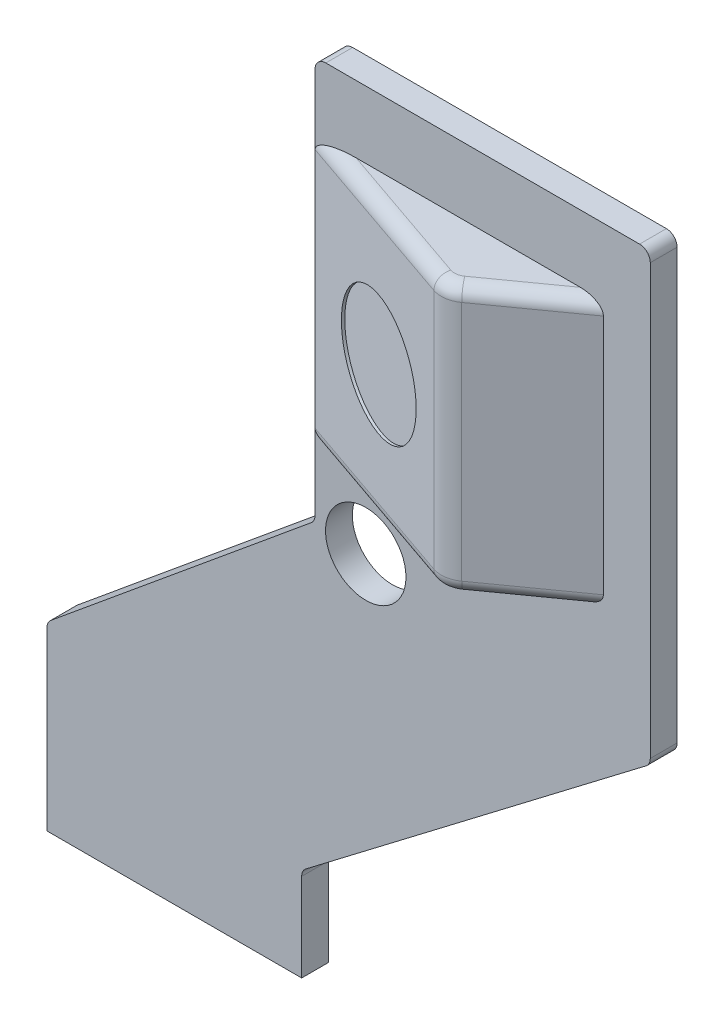
ISO-10303-21;
HEADER;
FILE_DESCRIPTION(('STEP AP214'),'2;1');
FILE_NAME('part.step','',(''),(''),'','','');
FILE_SCHEMA(('AUTOMOTIVE_DESIGN { 1 0 10303 214 1 1 1 1 }'));
ENDSEC;
DATA;
#1=APPLICATION_CONTEXT('core data for automotive mechanical design processes');
#2=APPLICATION_PROTOCOL_DEFINITION('international standard','automotive_design',2000,#1);
#3=PRODUCT_CONTEXT('',#1,'mechanical');
#4=PRODUCT('Part','Part','',(#3));
#5=PRODUCT_RELATED_PRODUCT_CATEGORY('part','',(#4));
#6=PRODUCT_DEFINITION_FORMATION('','',#4);
#7=PRODUCT_DEFINITION_CONTEXT('part definition',#1,'design');
#8=PRODUCT_DEFINITION('design','',#6,#7);
#9=PRODUCT_DEFINITION_SHAPE('','',#8);
#10=(LENGTH_UNIT() NAMED_UNIT(*) SI_UNIT(.MILLI.,.METRE.));
#11=(NAMED_UNIT(*) PLANE_ANGLE_UNIT() SI_UNIT($,.RADIAN.));
#12=(NAMED_UNIT(*) SI_UNIT($,.STERADIAN.) SOLID_ANGLE_UNIT());
#13=UNCERTAINTY_MEASURE_WITH_UNIT(LENGTH_MEASURE(1.E-05),#10,'distance_accuracy_value','');
#14=(GEOMETRIC_REPRESENTATION_CONTEXT(3) GLOBAL_UNCERTAINTY_ASSIGNED_CONTEXT((#13)) GLOBAL_UNIT_ASSIGNED_CONTEXT((#10,
#11,#12)) REPRESENTATION_CONTEXT('',''));
#15=CARTESIAN_POINT('',(0.,0.,0.));
#16=DIRECTION('',(0.,0.,1.));
#17=DIRECTION('',(1.,0.,0.));
#18=AXIS2_PLACEMENT_3D('',#15,#16,#17);
#19=CARTESIAN_POINT('',(-22.5,30.,0.));
#20=DIRECTION('',(0.,0.,-1.));
#21=DIRECTION('',(-1.,0.,0.));
#22=AXIS2_PLACEMENT_3D('',#19,#20,#21);
#23=PLANE('',#22);
#24=CARTESIAN_POINT('',(1.2792112476062,-0.215927904638984,0.));
#25=DIRECTION('',(0.,0.,1.));
#26=DIRECTION('',(1.,0.,0.));
#27=AXIS2_PLACEMENT_3D('',#24,#25,#26);
#28=CIRCLE('',#27,3.);
#29=CARTESIAN_POINT('',(4.2792112476062,-0.215927904638984,0.));
#30=VERTEX_POINT('',#29);
#31=EDGE_CURVE('E392',#30,#30,#28,.T.);
#32=ORIENTED_EDGE('',*,*,#31,.F.);
#33=EDGE_LOOP('',(#32));
#34=FACE_BOUND('',#33,.T.);
#35=DIRECTION('',(-0.771373278540077,-0.636382954795564,0.));
#36=VECTOR('',#35,1.);
#37=CARTESIAN_POINT('',(-22.5,-16.5,0.));
#38=LINE('',#37,#36);
#39=CARTESIAN_POINT('',(-2.79089363616354,-0.239987249834917,0.));
#40=VERTEX_POINT('',#39);
#41=CARTESIAN_POINT('',(-22.2091063638364,-16.2600127501651,0.));
#42=VERTEX_POINT('',#41);
#43=EDGE_CURVE('E194',#40,#42,#38,.T.);
#44=ORIENTED_EDGE('',*,*,#43,.T.);
#45=CARTESIAN_POINT('',(-21.7,-16.8771113729971,0.));
#46=DIRECTION('',(0.,0.,-1.));
#47=DIRECTION('',(-1.,0.,0.));
#48=AXIS2_PLACEMENT_3D('',#45,#46,#47);
#49=CIRCLE('',#48,0.8);
#50=CARTESIAN_POINT('',(-22.5,-16.8771113729971,0.));
#51=VERTEX_POINT('',#50);
#52=EDGE_CURVE('E269',#42,#51,#49,.F.);
#53=ORIENTED_EDGE('',*,*,#52,.T.);
#54=DIRECTION('',(0.,-1.,0.));
#55=VECTOR('',#54,1.);
#56=CARTESIAN_POINT('',(-22.5,-30.,0.));
#57=LINE('',#56,#55);
#58=CARTESIAN_POINT('',(-22.5,-30.,0.));
#59=VERTEX_POINT('',#58);
#60=EDGE_CURVE('E223',#51,#59,#57,.T.);
#61=ORIENTED_EDGE('',*,*,#60,.T.);
#62=DIRECTION('',(1.,0.,0.));
#63=VECTOR('',#62,1.);
#64=CARTESIAN_POINT('',(-3.49999999999999,-30.,0.));
#65=LINE('',#64,#63);
#66=CARTESIAN_POINT('',(-3.49999999999999,-30.,0.));
#67=VERTEX_POINT('',#66);
#68=EDGE_CURVE('E200',#59,#67,#65,.T.);
#69=ORIENTED_EDGE('',*,*,#68,.T.);
#70=DIRECTION('',(0.,1.,0.));
#71=VECTOR('',#70,1.);
#72=CARTESIAN_POINT('',(-3.49999999999999,-23.0388546298408,0.));
#73=LINE('',#72,#71);
#74=CARTESIAN_POINT('',(-3.49999999999999,-23.4349115523728,0.));
#75=VERTEX_POINT('',#74);
#76=EDGE_CURVE('E227',#67,#75,#73,.T.);
#77=ORIENTED_EDGE('',*,*,#76,.T.);
#78=CARTESIAN_POINT('',(-2.69999999999999,-23.4349115523728,0.));
#79=DIRECTION('',(0.,0.,-1.));
#80=DIRECTION('',(-1.,0.,0.));
#81=AXIS2_PLACEMENT_3D('',#78,#79,#80);
#82=CIRCLE('',#81,0.8);
#83=CARTESIAN_POINT('',(-3.18504204576897,-22.7987243049084,0.));
#84=VERTEX_POINT('',#83);
#85=EDGE_CURVE('E42',#75,#84,#82,.T.);
#86=ORIENTED_EDGE('',*,*,#85,.T.);
#87=DIRECTION('',(0.795234059330419,0.606302557211219,0.));
#88=VECTOR('',#87,1.);
#89=CARTESIAN_POINT('',(22.5,-3.21592790463898,0.));
#90=LINE('',#89,#88);
#91=CARTESIAN_POINT('',(22.185042045769,-3.45605822957133,0.));
#92=VERTEX_POINT('',#91);
#93=EDGE_CURVE('E230',#84,#92,#90,.T.);
#94=ORIENTED_EDGE('',*,*,#93,.T.);
#95=CARTESIAN_POINT('',(21.7,-2.819870982107,0.));
#96=DIRECTION('',(0.,0.,-1.));
#97=DIRECTION('',(-1.,0.,0.));
#98=AXIS2_PLACEMENT_3D('',#95,#96,#97);
#99=CIRCLE('',#98,0.8);
#100=CARTESIAN_POINT('',(22.5,-2.819870982107,0.));
#101=VERTEX_POINT('',#100);
#102=EDGE_CURVE('E267',#92,#101,#99,.F.);
#103=ORIENTED_EDGE('',*,*,#102,.T.);
#104=DIRECTION('',(0.,1.,0.));
#105=VECTOR('',#104,1.);
#106=CARTESIAN_POINT('',(22.5,30.,0.));
#107=LINE('',#106,#105);
#108=CARTESIAN_POINT('',(22.5,29.2,0.));
#109=VERTEX_POINT('',#108);
#110=EDGE_CURVE('E233',#101,#109,#107,.T.);
#111=ORIENTED_EDGE('',*,*,#110,.T.);
#112=CARTESIAN_POINT('',(21.7,29.2,0.));
#113=DIRECTION('',(0.,0.,-1.));
#114=DIRECTION('',(-1.,0.,0.));
#115=AXIS2_PLACEMENT_3D('',#112,#113,#114);
#116=CIRCLE('',#115,0.8);
#117=CARTESIAN_POINT('',(21.7,30.,0.));
#118=VERTEX_POINT('',#117);
#119=EDGE_CURVE('E263',#109,#118,#116,.F.);
#120=ORIENTED_EDGE('',*,*,#119,.T.);
#121=DIRECTION('',(-1.,0.,0.));
#122=VECTOR('',#121,1.);
#123=CARTESIAN_POINT('',(-2.50000000000001,30.,0.));
#124=LINE('',#123,#122);
#125=CARTESIAN_POINT('',(-1.70000000000001,30.,0.));
#126=VERTEX_POINT('',#125);
#127=EDGE_CURVE('E236',#118,#126,#124,.T.);
#128=ORIENTED_EDGE('',*,*,#127,.T.);
#129=CARTESIAN_POINT('',(-1.70000000000001,29.2,0.));
#130=DIRECTION('',(0.,0.,-1.));
#131=DIRECTION('',(-1.,0.,0.));
#132=AXIS2_PLACEMENT_3D('',#129,#130,#131);
#133=CIRCLE('',#132,0.8);
#134=CARTESIAN_POINT('',(-2.50000000000001,29.2,0.));
#135=VERTEX_POINT('',#134);
#136=EDGE_CURVE('E265',#126,#135,#133,.F.);
#137=ORIENTED_EDGE('',*,*,#136,.T.);
#138=DIRECTION('',(0.,-1.,0.));
#139=VECTOR('',#138,1.);
#140=CARTESIAN_POINT('',(-2.5,0.,0.));
#141=LINE('',#140,#139);
#142=CARTESIAN_POINT('',(-2.50000000000001,24.,0.));
#143=VERTEX_POINT('',#142);
#144=EDGE_CURVE('E247',#135,#143,#141,.T.);
#145=ORIENTED_EDGE('',*,*,#144,.T.);
#146=CARTESIAN_POINT('',(0.567572330035595,24.,0.));
#147=DIRECTION('',(0.,0.,-1.));
#148=DIRECTION('',(-1.,0.,0.));
#149=AXIS2_PLACEMENT_3D('',#146,#147,#148);
#150=ELLIPSE('',#149,3.0675723300356,1.);
#151=CARTESIAN_POINT('',(0.567572330035595,25.,0.));
#152=VERTEX_POINT('',#151);
#153=EDGE_CURVE('E378',#143,#152,#150,.T.);
#154=ORIENTED_EDGE('',*,*,#153,.T.);
#155=DIRECTION('',(-1.,0.,0.));
#156=VECTOR('',#155,1.);
#157=CARTESIAN_POINT('',(19.,25.,0.));
#158=LINE('',#157,#156);
#159=CARTESIAN_POINT('',(17.2795349465915,25.,0.));
#160=VERTEX_POINT('',#159);
#161=EDGE_CURVE('E327',#160,#152,#158,.T.);
#162=ORIENTED_EDGE('',*,*,#161,.F.);
#163=CARTESIAN_POINT('',(17.2795349465915,24.,0.));
#164=DIRECTION('',(0.,0.,-1.));
#165=DIRECTION('',(-1.,0.,0.));
#166=AXIS2_PLACEMENT_3D('',#163,#164,#165);
#167=ELLIPSE('',#166,1.72046505340853,1.);
#168=CARTESIAN_POINT('',(19.,24.,0.));
#169=VERTEX_POINT('',#168);
#170=EDGE_CURVE('E374',#160,#169,#167,.T.);
#171=ORIENTED_EDGE('',*,*,#170,.T.);
#172=DIRECTION('',(0.,1.,0.));
#173=VECTOR('',#172,1.);
#174=CARTESIAN_POINT('',(19.,5.,0.));
#175=LINE('',#174,#173);
#176=CARTESIAN_POINT('',(19.,6.,0.));
#177=VERTEX_POINT('',#176);
#178=EDGE_CURVE('E225',#177,#169,#175,.T.);
#179=ORIENTED_EDGE('',*,*,#178,.F.);
#180=CARTESIAN_POINT('',(17.2795349465915,6.,0.));
#181=DIRECTION('',(0.,0.,-1.));
#182=DIRECTION('',(1.,0.,0.));
#183=AXIS2_PLACEMENT_3D('',#180,#181,#182);
#184=ELLIPSE('',#183,1.72046505340853,1.);
#185=CARTESIAN_POINT('',(17.2795349465915,5.,0.));
#186=VERTEX_POINT('',#185);
#187=EDGE_CURVE('E386',#177,#186,#184,.T.);
#188=ORIENTED_EDGE('',*,*,#187,.T.);
#189=DIRECTION('',(-1.,0.,0.));
#190=VECTOR('',#189,1.);
#191=CARTESIAN_POINT('',(19.,5.,0.));
#192=LINE('',#191,#190);
#193=CARTESIAN_POINT('',(0.567572330035591,5.,0.));
#194=VERTEX_POINT('',#193);
#195=EDGE_CURVE('E330',#186,#194,#192,.T.);
#196=ORIENTED_EDGE('',*,*,#195,.T.);
#197=CARTESIAN_POINT('',(0.567572330035591,6.,0.));
#198=DIRECTION('',(0.,0.,-1.));
#199=DIRECTION('',(1.,0.,0.));
#200=AXIS2_PLACEMENT_3D('',#197,#198,#199);
#201=ELLIPSE('',#200,3.0675723300356,1.);
#202=CARTESIAN_POINT('',(-2.50000000000001,6.,0.));
#203=VERTEX_POINT('',#202);
#204=EDGE_CURVE('E255',#194,#203,#201,.T.);
#205=ORIENTED_EDGE('',*,*,#204,.T.);
#206=CARTESIAN_POINT('',(-2.5,0.377111372997143,0.));
#207=VERTEX_POINT('',#206);
#208=EDGE_CURVE('E239',#203,#207,#141,.T.);
#209=ORIENTED_EDGE('',*,*,#208,.T.);
#210=CARTESIAN_POINT('',(-3.3,0.377111372997143,0.));
#211=DIRECTION('',(0.,0.,-1.));
#212=DIRECTION('',(-1.,0.,0.));
#213=AXIS2_PLACEMENT_3D('',#210,#211,#212);
#214=CIRCLE('',#213,0.8);
#215=EDGE_CURVE('E297',#207,#40,#214,.T.);
#216=ORIENTED_EDGE('',*,*,#215,.T.);
#217=EDGE_LOOP('',(#44,#53,#61,#69,#77,#86,#94,#103,#111,#120,#128,#137,#145,#154,#162,#171,
#179,#188,#196,#205,#209,#216));
#218=FACE_BOUND('',#217,.T.);
#219=ADVANCED_FACE('F34',(#34,#218),#23,.F.);
#220=CARTESIAN_POINT('',(-22.5,-30.,-2.));
#221=DIRECTION('',(-1.,0.,0.));
#222=DIRECTION('',(0.,0.,1.));
#223=AXIS2_PLACEMENT_3D('',#220,#221,#222);
#224=PLANE('',#223);
#225=ORIENTED_EDGE('',*,*,#60,.F.);
#226=DIRECTION('',(0.,0.,1.));
#227=VECTOR('',#226,1.);
#228=CARTESIAN_POINT('',(-22.5,-16.8771113729971,-2.));
#229=LINE('',#228,#227);
#230=CARTESIAN_POINT('',(-22.5,-16.8771113729971,-2.));
#231=VERTEX_POINT('',#230);
#232=EDGE_CURVE('E190',#51,#231,#229,.F.);
#233=ORIENTED_EDGE('',*,*,#232,.T.);
#234=DIRECTION('',(0.,-1.,0.));
#235=VECTOR('',#234,1.);
#236=CARTESIAN_POINT('',(-22.5,-30.,-2.));
#237=LINE('',#236,#235);
#238=CARTESIAN_POINT('',(-22.5,-30.,-2.));
#239=VERTEX_POINT('',#238);
#240=EDGE_CURVE('E183',#231,#239,#237,.T.);
#241=ORIENTED_EDGE('',*,*,#240,.T.);
#242=DIRECTION('',(0.,0.,1.));
#243=VECTOR('',#242,1.);
#244=CARTESIAN_POINT('',(-22.5,-30.,-2.));
#245=LINE('',#244,#243);
#246=EDGE_CURVE('E187',#239,#59,#245,.T.);
#247=ORIENTED_EDGE('',*,*,#246,.T.);
#248=EDGE_LOOP('',(#225,#233,#241,#247));
#249=FACE_BOUND('',#248,.T.);
#250=ADVANCED_FACE('F186',(#249),#224,.T.);
#251=CARTESIAN_POINT('',(-22.5,-16.5,-2.));
#252=DIRECTION('',(-0.636382954795564,0.771373278540077,0.));
#253=DIRECTION('',(-0.771373278540077,-0.636382954795564,0.));
#254=AXIS2_PLACEMENT_3D('',#251,#252,#253);
#255=PLANE('',#254);
#256=ORIENTED_EDGE('',*,*,#43,.F.);
#257=DIRECTION('',(0.,0.,1.));
#258=VECTOR('',#257,1.);
#259=CARTESIAN_POINT('',(-2.79089363616355,-0.239987249834917,-2.));
#260=LINE('',#259,#258);
#261=CARTESIAN_POINT('',(-2.79089363616354,-0.239987249834917,-2.));
#262=VERTEX_POINT('',#261);
#263=EDGE_CURVE('E261',#40,#262,#260,.F.);
#264=ORIENTED_EDGE('',*,*,#263,.T.);
#265=DIRECTION('',(-0.771373278540077,-0.636382954795564,0.));
#266=VECTOR('',#265,1.);
#267=CARTESIAN_POINT('',(-22.5,-16.5,-2.));
#268=LINE('',#267,#266);
#269=CARTESIAN_POINT('',(-22.2091063638364,-16.2600127501651,-2.));
#270=VERTEX_POINT('',#269);
#271=EDGE_CURVE('E202',#262,#270,#268,.T.);
#272=ORIENTED_EDGE('',*,*,#271,.T.);
#273=DIRECTION('',(0.,0.,1.));
#274=VECTOR('',#273,1.);
#275=CARTESIAN_POINT('',(-22.2091063638364,-16.2600127501651,-2.));
#276=LINE('',#275,#274);
#277=EDGE_CURVE('E258',#270,#42,#276,.T.);
#278=ORIENTED_EDGE('',*,*,#277,.T.);
#279=EDGE_LOOP('',(#256,#264,#272,#278));
#280=FACE_BOUND('',#279,.T.);
#281=ADVANCED_FACE('F453',(#280),#255,.T.);
#282=CARTESIAN_POINT('',(-2.5,0.,-2.));
#283=DIRECTION('',(-1.,0.,0.));
#284=DIRECTION('',(0.,-1.,0.));
#285=AXIS2_PLACEMENT_3D('',#282,#283,#284);
#286=PLANE('',#285);
#287=DIRECTION('',(0.,-1.,0.));
#288=VECTOR('',#287,1.);
#289=CARTESIAN_POINT('',(-2.5,0.,-2.));
#290=LINE('',#289,#288);
#291=CARTESIAN_POINT('',(-2.50000000000001,29.2,-2.));
#292=VERTEX_POINT('',#291);
#293=CARTESIAN_POINT('',(-2.5,0.377111372997143,-2.));
#294=VERTEX_POINT('',#293);
#295=EDGE_CURVE('E218',#292,#294,#290,.T.);
#296=ORIENTED_EDGE('',*,*,#295,.T.);
#297=DIRECTION('',(0.,0.,1.));
#298=VECTOR('',#297,1.);
#299=CARTESIAN_POINT('',(-2.5,0.377111372997143,0.));
#300=LINE('',#299,#298);
#301=EDGE_CURVE('E254',#294,#207,#300,.T.);
#302=ORIENTED_EDGE('',*,*,#301,.T.);
#303=ORIENTED_EDGE('',*,*,#208,.F.);
#304=DIRECTION('',(0.,1.,0.));
#305=VECTOR('',#304,1.);
#306=CARTESIAN_POINT('',(-2.50000000000001,5.,0.));
#307=LINE('',#306,#305);
#308=EDGE_CURVE('E339',#203,#143,#307,.T.);
#309=ORIENTED_EDGE('',*,*,#308,.T.);
#310=ORIENTED_EDGE('',*,*,#144,.F.);
#311=DIRECTION('',(0.,0.,1.));
#312=VECTOR('',#311,1.);
#313=CARTESIAN_POINT('',(-2.50000000000001,29.2,-2.));
#314=LINE('',#313,#312);
#315=EDGE_CURVE('E252',#135,#292,#314,.F.);
#316=ORIENTED_EDGE('',*,*,#315,.T.);
#317=EDGE_LOOP('',(#296,#302,#303,#309,#310,#316));
#318=FACE_BOUND('',#317,.T.);
#319=ADVANCED_FACE('F420',(#318),#286,.T.);
#320=CARTESIAN_POINT('',(-2.50000000000001,30.,-2.));
#321=DIRECTION('',(0.,1.,0.));
#322=DIRECTION('',(0.,0.,1.));
#323=AXIS2_PLACEMENT_3D('',#320,#321,#322);
#324=PLANE('',#323);
#325=DIRECTION('',(-1.,0.,0.));
#326=VECTOR('',#325,1.);
#327=CARTESIAN_POINT('',(-2.50000000000001,30.,-2.));
#328=LINE('',#327,#326);
#329=CARTESIAN_POINT('',(21.7,30.,-2.));
#330=VERTEX_POINT('',#329);
#331=CARTESIAN_POINT('',(-1.70000000000001,30.,-2.));
#332=VERTEX_POINT('',#331);
#333=EDGE_CURVE('E215',#330,#332,#328,.T.);
#334=ORIENTED_EDGE('',*,*,#333,.T.);
#335=DIRECTION('',(0.,0.,1.));
#336=VECTOR('',#335,1.);
#337=CARTESIAN_POINT('',(-1.70000000000001,30.,-2.));
#338=LINE('',#337,#336);
#339=EDGE_CURVE('E294',#332,#126,#338,.T.);
#340=ORIENTED_EDGE('',*,*,#339,.T.);
#341=ORIENTED_EDGE('',*,*,#127,.F.);
#342=DIRECTION('',(0.,0.,1.));
#343=VECTOR('',#342,1.);
#344=CARTESIAN_POINT('',(21.7,30.,-2.));
#345=LINE('',#344,#343);
#346=EDGE_CURVE('E292',#118,#330,#345,.F.);
#347=ORIENTED_EDGE('',*,*,#346,.T.);
#348=EDGE_LOOP('',(#334,#340,#341,#347));
#349=FACE_BOUND('',#348,.T.);
#350=ADVANCED_FACE('F463',(#349),#324,.T.);
#351=CARTESIAN_POINT('',(22.5,30.,-2.));
#352=DIRECTION('',(1.,0.,0.));
#353=DIRECTION('',(0.,1.,0.));
#354=AXIS2_PLACEMENT_3D('',#351,#352,#353);
#355=PLANE('',#354);
#356=ORIENTED_EDGE('',*,*,#110,.F.);
#357=DIRECTION('',(0.,0.,1.));
#358=VECTOR('',#357,1.);
#359=CARTESIAN_POINT('',(22.5,-2.819870982107,-2.));
#360=LINE('',#359,#358);
#361=CARTESIAN_POINT('',(22.5,-2.819870982107,-2.));
#362=VERTEX_POINT('',#361);
#363=EDGE_CURVE('E290',#101,#362,#360,.F.);
#364=ORIENTED_EDGE('',*,*,#363,.T.);
#365=DIRECTION('',(0.,1.,0.));
#366=VECTOR('',#365,1.);
#367=CARTESIAN_POINT('',(22.5,30.,-2.));
#368=LINE('',#367,#366);
#369=CARTESIAN_POINT('',(22.5,29.2,-2.));
#370=VERTEX_POINT('',#369);
#371=EDGE_CURVE('E212',#362,#370,#368,.T.);
#372=ORIENTED_EDGE('',*,*,#371,.T.);
#373=DIRECTION('',(0.,0.,1.));
#374=VECTOR('',#373,1.);
#375=CARTESIAN_POINT('',(22.5,29.2,-2.));
#376=LINE('',#375,#374);
#377=EDGE_CURVE('E287',#370,#109,#376,.T.);
#378=ORIENTED_EDGE('',*,*,#377,.T.);
#379=EDGE_LOOP('',(#356,#364,#372,#378));
#380=FACE_BOUND('',#379,.T.);
#381=ADVANCED_FACE('F466',(#380),#355,.T.);
#382=CARTESIAN_POINT('',(22.5,-3.21592790463898,-2.));
#383=DIRECTION('',(0.606302557211219,-0.795234059330419,0.));
#384=DIRECTION('',(0.795234059330419,0.606302557211219,0.));
#385=AXIS2_PLACEMENT_3D('',#382,#383,#384);
#386=PLANE('',#385);
#387=ORIENTED_EDGE('',*,*,#93,.F.);
#388=DIRECTION('',(0.,0.,1.));
#389=VECTOR('',#388,1.);
#390=CARTESIAN_POINT('',(-3.18504204576896,-22.7987243049084,-2.));
#391=LINE('',#390,#389);
#392=CARTESIAN_POINT('',(-3.18504204576897,-22.7987243049084,-2.));
#393=VERTEX_POINT('',#392);
#394=EDGE_CURVE('E285',#84,#393,#391,.F.);
#395=ORIENTED_EDGE('',*,*,#394,.T.);
#396=DIRECTION('',(0.795234059330419,0.606302557211219,0.));
#397=VECTOR('',#396,1.);
#398=CARTESIAN_POINT('',(22.5,-3.21592790463898,-2.));
#399=LINE('',#398,#397);
#400=CARTESIAN_POINT('',(22.185042045769,-3.45605822957133,-2.));
#401=VERTEX_POINT('',#400);
#402=EDGE_CURVE('E207',#393,#401,#399,.T.);
#403=ORIENTED_EDGE('',*,*,#402,.T.);
#404=DIRECTION('',(0.,0.,1.));
#405=VECTOR('',#404,1.);
#406=CARTESIAN_POINT('',(22.185042045769,-3.45605822957133,-2.));
#407=LINE('',#406,#405);
#408=EDGE_CURVE('E282',#401,#92,#407,.T.);
#409=ORIENTED_EDGE('',*,*,#408,.T.);
#410=EDGE_LOOP('',(#387,#395,#403,#409));
#411=FACE_BOUND('',#410,.T.);
#412=ADVANCED_FACE('F308',(#411),#386,.T.);
#413=CARTESIAN_POINT('',(-3.49999999999999,-23.0388546298408,-2.));
#414=DIRECTION('',(1.,0.,0.));
#415=DIRECTION('',(0.,1.,0.));
#416=AXIS2_PLACEMENT_3D('',#413,#414,#415);
#417=PLANE('',#416);
#418=DIRECTION('',(0.,1.,0.));
#419=VECTOR('',#418,1.);
#420=CARTESIAN_POINT('',(-3.49999999999999,-23.0388546298408,-2.));
#421=LINE('',#420,#419);
#422=CARTESIAN_POINT('',(-3.49999999999999,-30.,-2.));
#423=VERTEX_POINT('',#422);
#424=CARTESIAN_POINT('',(-3.49999999999999,-23.4349115523728,-2.));
#425=VERTEX_POINT('',#424);
#426=EDGE_CURVE('E205',#423,#425,#421,.T.);
#427=ORIENTED_EDGE('',*,*,#426,.T.);
#428=DIRECTION('',(0.,0.,1.));
#429=VECTOR('',#428,1.);
#430=CARTESIAN_POINT('',(-3.49999999999999,-23.4349115523728,0.));
#431=LINE('',#430,#429);
#432=EDGE_CURVE('E279',#425,#75,#431,.T.);
#433=ORIENTED_EDGE('',*,*,#432,.T.);
#434=ORIENTED_EDGE('',*,*,#76,.F.);
#435=DIRECTION('',(0.,0.,1.));
#436=VECTOR('',#435,1.);
#437=CARTESIAN_POINT('',(-3.49999999999999,-30.,-2.));
#438=LINE('',#437,#436);
#439=EDGE_CURVE('E201',#423,#67,#438,.T.);
#440=ORIENTED_EDGE('',*,*,#439,.F.);
#441=EDGE_LOOP('',(#427,#433,#434,#440));
#442=FACE_BOUND('',#441,.T.);
#443=ADVANCED_FACE('F312',(#442),#417,.T.);
#444=CARTESIAN_POINT('',(-3.49999999999999,-30.,-2.));
#445=DIRECTION('',(0.,-1.,0.));
#446=DIRECTION('',(0.,0.,-1.));
#447=AXIS2_PLACEMENT_3D('',#444,#445,#446);
#448=PLANE('',#447);
#449=ORIENTED_EDGE('',*,*,#68,.F.);
#450=ORIENTED_EDGE('',*,*,#246,.F.);
#451=DIRECTION('',(1.,0.,0.));
#452=VECTOR('',#451,1.);
#453=CARTESIAN_POINT('',(-3.49999999999999,-30.,-2.));
#454=LINE('',#453,#452);
#455=EDGE_CURVE('E193',#239,#423,#454,.T.);
#456=ORIENTED_EDGE('',*,*,#455,.T.);
#457=ORIENTED_EDGE('',*,*,#439,.T.);
#458=EDGE_LOOP('',(#449,#450,#456,#457));
#459=FACE_BOUND('',#458,.T.);
#460=ADVANCED_FACE('F198',(#459),#448,.T.);
#461=CARTESIAN_POINT('',(-22.5,30.,-2.));
#462=DIRECTION('',(0.,0.,-1.));
#463=DIRECTION('',(-1.,0.,0.));
#464=AXIS2_PLACEMENT_3D('',#461,#462,#463);
#465=PLANE('',#464);
#466=CARTESIAN_POINT('',(1.2792112476062,-0.215927904638984,-2.));
#467=DIRECTION('',(0.,0.,1.));
#468=DIRECTION('',(1.,0.,0.));
#469=AXIS2_PLACEMENT_3D('',#466,#467,#468);
#470=CIRCLE('',#469,3.);
#471=CARTESIAN_POINT('',(4.2792112476062,-0.215927904638984,-2.));
#472=VERTEX_POINT('',#471);
#473=EDGE_CURVE('E486',#472,#472,#470,.T.);
#474=ORIENTED_EDGE('',*,*,#473,.T.);
#475=EDGE_LOOP('',(#474));
#476=FACE_BOUND('',#475,.T.);
#477=ORIENTED_EDGE('',*,*,#240,.F.);
#478=CARTESIAN_POINT('',(-21.7,-16.8771113729971,-2.));
#479=DIRECTION('',(0.,0.,-1.));
#480=DIRECTION('',(-1.,0.,0.));
#481=AXIS2_PLACEMENT_3D('',#478,#479,#480);
#482=CIRCLE('',#481,0.8);
#483=EDGE_CURVE('E277',#231,#270,#482,.T.);
#484=ORIENTED_EDGE('',*,*,#483,.T.);
#485=ORIENTED_EDGE('',*,*,#271,.F.);
#486=CARTESIAN_POINT('',(-3.3,0.377111372997143,-2.));
#487=DIRECTION('',(0.,0.,-1.));
#488=DIRECTION('',(-1.,0.,0.));
#489=AXIS2_PLACEMENT_3D('',#486,#487,#488);
#490=CIRCLE('',#489,0.8);
#491=EDGE_CURVE('E299',#262,#294,#490,.F.);
#492=ORIENTED_EDGE('',*,*,#491,.T.);
#493=ORIENTED_EDGE('',*,*,#295,.F.);
#494=CARTESIAN_POINT('',(-1.70000000000001,29.2,-2.));
#495=DIRECTION('',(0.,0.,-1.));
#496=DIRECTION('',(-1.,0.,0.));
#497=AXIS2_PLACEMENT_3D('',#494,#495,#496);
#498=CIRCLE('',#497,0.8);
#499=EDGE_CURVE('E274',#292,#332,#498,.T.);
#500=ORIENTED_EDGE('',*,*,#499,.T.);
#501=ORIENTED_EDGE('',*,*,#333,.F.);
#502=CARTESIAN_POINT('',(21.7,29.2,-2.));
#503=DIRECTION('',(0.,0.,-1.));
#504=DIRECTION('',(-1.,0.,0.));
#505=AXIS2_PLACEMENT_3D('',#502,#503,#504);
#506=CIRCLE('',#505,0.8);
#507=EDGE_CURVE('E272',#330,#370,#506,.T.);
#508=ORIENTED_EDGE('',*,*,#507,.T.);
#509=ORIENTED_EDGE('',*,*,#371,.F.);
#510=CARTESIAN_POINT('',(21.7,-2.819870982107,-2.));
#511=DIRECTION('',(0.,0.,-1.));
#512=DIRECTION('',(-1.,0.,0.));
#513=AXIS2_PLACEMENT_3D('',#510,#511,#512);
#514=CIRCLE('',#513,0.8);
#515=EDGE_CURVE('E53',#362,#401,#514,.T.);
#516=ORIENTED_EDGE('',*,*,#515,.T.);
#517=ORIENTED_EDGE('',*,*,#402,.F.);
#518=CARTESIAN_POINT('',(-2.69999999999999,-23.4349115523728,-2.));
#519=DIRECTION('',(0.,0.,-1.));
#520=DIRECTION('',(-1.,0.,0.));
#521=AXIS2_PLACEMENT_3D('',#518,#519,#520);
#522=CIRCLE('',#521,0.8);
#523=EDGE_CURVE('E11',#393,#425,#522,.F.);
#524=ORIENTED_EDGE('',*,*,#523,.T.);
#525=ORIENTED_EDGE('',*,*,#426,.F.);
#526=ORIENTED_EDGE('',*,*,#455,.F.);
#527=EDGE_LOOP('',(#477,#484,#485,#492,#493,#500,#501,#508,#509,#516,#517,#524,#525,#526));
#528=FACE_BOUND('',#527,.T.);
#529=ADVANCED_FACE('F204',(#476,#528),#465,.T.);
#530=CARTESIAN_POINT('',(12.,5.,5.));
#531=DIRECTION('',(0.581238193719096,0.,0.813733471206735));
#532=DIRECTION('',(0.813733471206735,0.,-0.581238193719096));
#533=AXIS2_PLACEMENT_3D('',#530,#531,#532);
#534=PLANE('',#533);
#535=ORIENTED_EDGE('',*,*,#178,.T.);
#536=DIRECTION('',(0.813733471206735,0.,-0.581238193719096));
#537=VECTOR('',#536,1.);
#538=CARTESIAN_POINT('',(12.8393380651894,24.,4.40047281057899));
#539=LINE('',#538,#537);
#540=CARTESIAN_POINT('',(12.8393380651894,24.,4.40047281057899));
#541=VERTEX_POINT('',#540);
#542=EDGE_CURVE('E364',#169,#541,#539,.F.);
#543=ORIENTED_EDGE('',*,*,#542,.T.);
#544=DIRECTION('',(0.,1.,0.));
#545=VECTOR('',#544,1.);
#546=CARTESIAN_POINT('',(12.8393380651894,5.,4.40047281057899));
#547=LINE('',#546,#545);
#548=CARTESIAN_POINT('',(12.8393380651894,6.,4.40047281057899));
#549=VERTEX_POINT('',#548);
#550=EDGE_CURVE('E315',#541,#549,#547,.F.);
#551=ORIENTED_EDGE('',*,*,#550,.T.);
#552=DIRECTION('',(0.813733471206735,0.,-0.581238193719096));
#553=VECTOR('',#552,1.);
#554=CARTESIAN_POINT('',(12.,6.,5.));
#555=LINE('',#554,#553);
#556=EDGE_CURVE('E367',#549,#177,#555,.T.);
#557=ORIENTED_EDGE('',*,*,#556,.T.);
#558=EDGE_LOOP('',(#535,#543,#551,#557));
#559=FACE_BOUND('',#558,.T.);
#560=ADVANCED_FACE('F363',(#559),#534,.T.);
#561=CARTESIAN_POINT('',(-2.50000000000001,5.,0.));
#562=DIRECTION('',(-0.325990683319404,0.,0.945372981626272));
#563=DIRECTION('',(0.945372981626272,0.,0.325990683319404));
#564=AXIS2_PLACEMENT_3D('',#561,#562,#563);
#565=PLANE('',#564);
#566=CARTESIAN_POINT('',(4.75,15.,2.5));
#567=DIRECTION('',(-0.325990683319404,0.,0.945372981626272));
#568=DIRECTION('',(0.945372981626272,0.,0.325990683319404));
#569=AXIS2_PLACEMENT_3D('',#566,#567,#568);
#570=CIRCLE('',#569,4.5);
#571=CARTESIAN_POINT('',(9.00417841731823,15.,3.96695807493732));
#572=VERTEX_POINT('',#571);
#573=EDGE_CURVE('E357',#572,#572,#570,.T.);
#574=ORIENTED_EDGE('',*,*,#573,.F.);
#575=EDGE_LOOP('',(#574));
#576=FACE_BOUND('',#575,.T.);
#577=DIRECTION('',(0.,1.,0.));
#578=VECTOR('',#577,1.);
#579=CARTESIAN_POINT('',(11.0248803111124,5.,4.66375183141807));
#580=LINE('',#579,#578);
#581=CARTESIAN_POINT('',(11.0248803111124,6.,4.66375183141807));
#582=VERTEX_POINT('',#581);
#583=CARTESIAN_POINT('',(11.0248803111124,24.,4.66375183141807));
#584=VERTEX_POINT('',#583);
#585=EDGE_CURVE('E313',#582,#584,#580,.T.);
#586=ORIENTED_EDGE('',*,*,#585,.T.);
#587=DIRECTION('',(0.945372981626272,0.,0.325990683319404));
#588=VECTOR('',#587,1.);
#589=CARTESIAN_POINT('',(-2.50000000000001,24.,0.));
#590=LINE('',#589,#588);
#591=EDGE_CURVE('E344',#584,#143,#590,.F.);
#592=ORIENTED_EDGE('',*,*,#591,.T.);
#593=ORIENTED_EDGE('',*,*,#308,.F.);
#594=DIRECTION('',(0.945372981626272,0.,0.325990683319404));
#595=VECTOR('',#594,1.);
#596=CARTESIAN_POINT('',(-2.50000000000001,6.,0.));
#597=LINE('',#596,#595);
#598=EDGE_CURVE('E338',#203,#582,#597,.T.);
#599=ORIENTED_EDGE('',*,*,#598,.T.);
#600=EDGE_LOOP('',(#586,#592,#593,#599));
#601=FACE_BOUND('',#600,.T.);
#602=ADVANCED_FACE('F416',(#576,#601),#565,.T.);
#603=CARTESIAN_POINT('',(19.,5.,0.));
#604=DIRECTION('',(0.,-1.,0.));
#605=DIRECTION('',(0.,0.,-1.));
#606=AXIS2_PLACEMENT_3D('',#603,#604,#605);
#607=PLANE('',#606);
#608=ORIENTED_EDGE('',*,*,#195,.F.);
#609=DIRECTION('',(0.813733471206735,0.,-0.581238193719096));
#610=VECTOR('',#609,1.);
#611=CARTESIAN_POINT('',(18.4187618062809,5.,-0.813733471206737));
#612=LINE('',#611,#610);
#613=CARTESIAN_POINT('',(12.2580998714703,5.,3.58673933937226));
#614=VERTEX_POINT('',#613);
#615=EDGE_CURVE('E381',#186,#614,#612,.F.);
#616=ORIENTED_EDGE('',*,*,#615,.T.);
#617=CARTESIAN_POINT('',(11.6768616777512,5.,2.77300586816552));
#618=DIRECTION('',(0.,-1.,0.));
#619=DIRECTION('',(0.,0.,-1.));
#620=AXIS2_PLACEMENT_3D('',#617,#618,#619);
#621=CIRCLE('',#620,1.);
#622=CARTESIAN_POINT('',(11.3508709944318,5.,3.7183788497918));
#623=VERTEX_POINT('',#622);
#624=EDGE_CURVE('E403',#614,#623,#621,.T.);
#625=ORIENTED_EDGE('',*,*,#624,.T.);
#626=DIRECTION('',(0.945372981626272,0.,0.325990683319404));
#627=VECTOR('',#626,1.);
#628=CARTESIAN_POINT('',(17.0411872826818,5.,5.68055688022282));
#629=LINE('',#628,#627);
#630=EDGE_CURVE('E350',#623,#194,#629,.F.);
#631=ORIENTED_EDGE('',*,*,#630,.T.);
#632=EDGE_LOOP('',(#608,#616,#625,#631));
#633=FACE_BOUND('',#632,.T.);
#634=ADVANCED_FACE('F410',(#633),#607,.T.);
#635=CARTESIAN_POINT('',(19.,25.,0.));
#636=DIRECTION('',(0.,-1.,0.));
#637=DIRECTION('',(0.,0.,-1.));
#638=AXIS2_PLACEMENT_3D('',#635,#636,#637);
#639=PLANE('',#638);
#640=ORIENTED_EDGE('',*,*,#161,.T.);
#641=DIRECTION('',(0.945372981626272,0.,0.325990683319404));
#642=VECTOR('',#641,1.);
#643=CARTESIAN_POINT('',(11.3508709944318,25.,3.71837884979179));
#644=LINE('',#643,#642);
#645=CARTESIAN_POINT('',(11.3508709944318,25.,3.7183788497918));
#646=VERTEX_POINT('',#645);
#647=EDGE_CURVE('E335',#152,#646,#644,.T.);
#648=ORIENTED_EDGE('',*,*,#647,.T.);
#649=CARTESIAN_POINT('',(11.6768616777512,25.,2.77300586816552));
#650=DIRECTION('',(0.,-1.,0.));
#651=DIRECTION('',(0.,0.,-1.));
#652=AXIS2_PLACEMENT_3D('',#649,#650,#651);
#653=CIRCLE('',#652,1.);
#654=CARTESIAN_POINT('',(12.2580998714703,25.,3.58673933937226));
#655=VERTEX_POINT('',#654);
#656=EDGE_CURVE('E333',#646,#655,#653,.F.);
#657=ORIENTED_EDGE('',*,*,#656,.T.);
#658=DIRECTION('',(0.813733471206735,0.,-0.581238193719096));
#659=VECTOR('',#658,1.);
#660=CARTESIAN_POINT('',(18.4187618062809,25.,-0.813733471206737));
#661=LINE('',#660,#659);
#662=EDGE_CURVE('E322',#655,#160,#661,.T.);
#663=ORIENTED_EDGE('',*,*,#662,.T.);
#664=EDGE_LOOP('',(#640,#648,#657,#663));
#665=FACE_BOUND('',#664,.T.);
#666=ADVANCED_FACE('F428',(#665),#639,.F.);
#667=CARTESIAN_POINT('',(4.81519813666388,15.,2.31092540367474));
#668=DIRECTION('',(-0.325990683319404,0.,0.945372981626272));
#669=DIRECTION('',(0.945372981626272,0.,0.325990683319404));
#670=AXIS2_PLACEMENT_3D('',#667,#668,#669);
#671=CYLINDRICAL_SURFACE('',#670,4.5);
#672=CARTESIAN_POINT('',(4.81519813666388,15.,2.31092540367474));
#673=DIRECTION('',(-0.325990683319404,0.,0.945372981626272));
#674=DIRECTION('',(0.945372981626272,0.,0.325990683319404));
#675=AXIS2_PLACEMENT_3D('',#672,#673,#674);
#676=CIRCLE('',#675,4.5);
#677=CARTESIAN_POINT('',(9.0693765539821,15.,3.77788347861206));
#678=VERTEX_POINT('',#677);
#679=EDGE_CURVE('E331',#678,#678,#676,.T.);
#680=ORIENTED_EDGE('',*,*,#679,.F.);
#681=EDGE_LOOP('',(#680));
#682=FACE_BOUND('',#681,.T.);
#683=ORIENTED_EDGE('',*,*,#573,.T.);
#684=EDGE_LOOP('',(#683));
#685=FACE_BOUND('',#684,.T.);
#686=ADVANCED_FACE('F495',(#682,#685),#671,.F.);
#687=CARTESIAN_POINT('',(4.81519813666388,15.,2.31092540367474));
#688=DIRECTION('',(-0.325990683319404,0.,0.945372981626272));
#689=DIRECTION('',(0.945372981626272,0.,0.325990683319404));
#690=AXIS2_PLACEMENT_3D('',#687,#688,#689);
#691=PLANE('',#690);
#692=ORIENTED_EDGE('',*,*,#679,.T.);
#693=EDGE_LOOP('',(#692));
#694=FACE_BOUND('',#693,.T.);
#695=ADVANCED_FACE('F442',(#694),#691,.T.);
#696=CARTESIAN_POINT('',(1.2792112476062,-0.215927904638984,-2.));
#697=DIRECTION('',(0.,0.,1.));
#698=DIRECTION('',(1.,0.,0.));
#699=AXIS2_PLACEMENT_3D('',#696,#697,#698);
#700=CYLINDRICAL_SURFACE('',#699,3.);
#701=ORIENTED_EDGE('',*,*,#473,.F.);
#702=EDGE_LOOP('',(#701));
#703=FACE_BOUND('',#702,.T.);
#704=ORIENTED_EDGE('',*,*,#31,.T.);
#705=EDGE_LOOP('',(#704));
#706=FACE_BOUND('',#705,.T.);
#707=ADVANCED_FACE('F435',(#703,#706),#700,.F.);
#708=CARTESIAN_POINT('',(11.6768616777512,5.,2.77300586816552));
#709=DIRECTION('',(0.,1.,0.));
#710=DIRECTION('',(0.,0.,1.));
#711=AXIS2_PLACEMENT_3D('',#708,#709,#710);
#712=CYLINDRICAL_SURFACE('',#711,2.);
#713=ORIENTED_EDGE('',*,*,#550,.F.);
#714=CARTESIAN_POINT('',(11.6768616777512,24.,2.77300586816552));
#715=DIRECTION('',(0.,-1.,0.));
#716=DIRECTION('',(0.,0.,-1.));
#717=AXIS2_PLACEMENT_3D('',#714,#715,#716);
#718=CIRCLE('',#717,2.);
#719=EDGE_CURVE('E348',#541,#584,#718,.T.);
#720=ORIENTED_EDGE('',*,*,#719,.T.);
#721=ORIENTED_EDGE('',*,*,#585,.F.);
#722=CARTESIAN_POINT('',(11.6768616777512,6.,2.77300586816552));
#723=DIRECTION('',(0.,-1.,0.));
#724=DIRECTION('',(0.,0.,-1.));
#725=AXIS2_PLACEMENT_3D('',#722,#723,#724);
#726=CIRCLE('',#725,2.);
#727=EDGE_CURVE('E346',#582,#549,#726,.F.);
#728=ORIENTED_EDGE('',*,*,#727,.T.);
#729=EDGE_LOOP('',(#713,#720,#721,#728));
#730=FACE_BOUND('',#729,.T.);
#731=ADVANCED_FACE('F433',(#730),#712,.T.);
#732=CARTESIAN_POINT('',(18.4187618062809,24.,-0.813733471206736));
#733=DIRECTION('',(-0.813733471206735,0.,0.581238193719096));
#734=DIRECTION('',(0.581238193719096,0.,0.813733471206735));
#735=AXIS2_PLACEMENT_3D('',#732,#733,#734);
#736=CYLINDRICAL_SURFACE('',#735,1.);
#737=ORIENTED_EDGE('',*,*,#170,.F.);
#738=ORIENTED_EDGE('',*,*,#662,.F.);
#739=CARTESIAN_POINT('',(12.2580998714703,24.,3.58673933937226));
#740=DIRECTION('',(-0.813733471206735,0.,0.581238193719096));
#741=DIRECTION('',(0.581238193719096,0.,0.813733471206735));
#742=AXIS2_PLACEMENT_3D('',#739,#740,#741);
#743=CIRCLE('',#742,1.);
#744=EDGE_CURVE('E376',#541,#655,#743,.T.);
#745=ORIENTED_EDGE('',*,*,#744,.F.);
#746=ORIENTED_EDGE('',*,*,#542,.F.);
#747=EDGE_LOOP('',(#737,#738,#745,#746));
#748=FACE_BOUND('',#747,.T.);
#749=ADVANCED_FACE('F372',(#748),#736,.T.);
#750=CARTESIAN_POINT('',(11.6768616777512,24.,2.77300586816552));
#751=DIRECTION('',(0.,-1.,0.));
#752=DIRECTION('',(0.,0.,-1.));
#753=AXIS2_PLACEMENT_3D('',#750,#751,#752);
#754=DEGENERATE_TOROIDAL_SURFACE('',#753,1.,1.,.T.);
#755=ORIENTED_EDGE('',*,*,#744,.T.);
#756=ORIENTED_EDGE('',*,*,#656,.F.);
#757=CARTESIAN_POINT('',(11.3508709944318,24.,3.7183788497918));
#758=DIRECTION('',(-0.945372981626272,0.,-0.325990683319404));
#759=DIRECTION('',(-0.325990683319404,0.,0.945372981626272));
#760=AXIS2_PLACEMENT_3D('',#757,#758,#759);
#761=CIRCLE('',#760,1.);
#762=EDGE_CURVE('E390',#584,#646,#761,.T.);
#763=ORIENTED_EDGE('',*,*,#762,.F.);
#764=ORIENTED_EDGE('',*,*,#719,.F.);
#765=EDGE_LOOP('',(#755,#756,#763,#764));
#766=FACE_BOUND('',#765,.T.);
#767=ADVANCED_FACE('F431',(#766),#754,.T.);
#768=CARTESIAN_POINT('',(17.0411872826818,24.,5.68055688022282));
#769=DIRECTION('',(-0.945372981626272,0.,-0.325990683319404));
#770=DIRECTION('',(-0.325990683319404,0.,0.945372981626272));
#771=AXIS2_PLACEMENT_3D('',#768,#769,#770);
#772=CYLINDRICAL_SURFACE('',#771,1.);
#773=ORIENTED_EDGE('',*,*,#153,.F.);
#774=ORIENTED_EDGE('',*,*,#591,.F.);
#775=ORIENTED_EDGE('',*,*,#762,.T.);
#776=ORIENTED_EDGE('',*,*,#647,.F.);
#777=EDGE_LOOP('',(#773,#774,#775,#776));
#778=FACE_BOUND('',#777,.T.);
#779=ADVANCED_FACE('F424',(#778),#772,.T.);
#780=CARTESIAN_POINT('',(11.4187618062809,6.,4.18626652879326));
#781=DIRECTION('',(0.813733471206735,0.,-0.581238193719096));
#782=DIRECTION('',(-0.581238193719096,0.,-0.813733471206735));
#783=AXIS2_PLACEMENT_3D('',#780,#781,#782);
#784=CYLINDRICAL_SURFACE('',#783,1.);
#785=ORIENTED_EDGE('',*,*,#187,.F.);
#786=ORIENTED_EDGE('',*,*,#556,.F.);
#787=CARTESIAN_POINT('',(12.2580998714703,6.,3.58673933937226));
#788=DIRECTION('',(-0.813733471206735,0.,0.581238193719096));
#789=DIRECTION('',(0.581238193719096,0.,0.813733471206735));
#790=AXIS2_PLACEMENT_3D('',#787,#788,#789);
#791=CIRCLE('',#790,1.);
#792=EDGE_CURVE('E250',#614,#549,#791,.T.);
#793=ORIENTED_EDGE('',*,*,#792,.F.);
#794=ORIENTED_EDGE('',*,*,#615,.F.);
#795=EDGE_LOOP('',(#785,#786,#793,#794));
#796=FACE_BOUND('',#795,.T.);
#797=ADVANCED_FACE('F406',(#796),#784,.T.);
#798=CARTESIAN_POINT('',(-2.1740093166806,6.,-0.945372981626272));
#799=DIRECTION('',(0.945372981626272,0.,0.325990683319404));
#800=DIRECTION('',(0.325990683319404,0.,-0.945372981626272));
#801=AXIS2_PLACEMENT_3D('',#798,#799,#800);
#802=CYLINDRICAL_SURFACE('',#801,1.);
#803=ORIENTED_EDGE('',*,*,#204,.F.);
#804=ORIENTED_EDGE('',*,*,#630,.F.);
#805=CARTESIAN_POINT('',(11.3508709944318,6.,3.7183788497918));
#806=DIRECTION('',(0.945372981626272,0.,0.325990683319404));
#807=DIRECTION('',(0.325990683319404,0.,-0.945372981626272));
#808=AXIS2_PLACEMENT_3D('',#805,#806,#807);
#809=CIRCLE('',#808,1.);
#810=EDGE_CURVE('E393',#582,#623,#809,.T.);
#811=ORIENTED_EDGE('',*,*,#810,.F.);
#812=ORIENTED_EDGE('',*,*,#598,.F.);
#813=EDGE_LOOP('',(#803,#804,#811,#812));
#814=FACE_BOUND('',#813,.T.);
#815=ADVANCED_FACE('F412',(#814),#802,.T.);
#816=CARTESIAN_POINT('',(11.6768616777512,6.,2.77300586816552));
#817=DIRECTION('',(0.,-1.,0.));
#818=DIRECTION('',(0.,0.,-1.));
#819=AXIS2_PLACEMENT_3D('',#816,#817,#818);
#820=DEGENERATE_TOROIDAL_SURFACE('',#819,1.,1.,.T.);
#821=ORIENTED_EDGE('',*,*,#792,.T.);
#822=ORIENTED_EDGE('',*,*,#727,.F.);
#823=ORIENTED_EDGE('',*,*,#810,.T.);
#824=ORIENTED_EDGE('',*,*,#624,.F.);
#825=EDGE_LOOP('',(#821,#822,#823,#824));
#826=FACE_BOUND('',#825,.T.);
#827=ADVANCED_FACE('F401',(#826),#820,.T.);
#828=CARTESIAN_POINT('',(-3.3,0.377111372997143,-2.));
#829=DIRECTION('',(0.,0.,-1.));
#830=DIRECTION('',(-1.,0.,0.));
#831=AXIS2_PLACEMENT_3D('',#828,#829,#830);
#832=CYLINDRICAL_SURFACE('',#831,0.8);
#833=ORIENTED_EDGE('',*,*,#491,.F.);
#834=ORIENTED_EDGE('',*,*,#263,.F.);
#835=ORIENTED_EDGE('',*,*,#215,.F.);
#836=ORIENTED_EDGE('',*,*,#301,.F.);
#837=EDGE_LOOP('',(#833,#834,#835,#836));
#838=FACE_BOUND('',#837,.T.);
#839=ADVANCED_FACE('F592',(#838),#832,.F.);
#840=CARTESIAN_POINT('',(-21.7,-16.8771113729971,-2.));
#841=DIRECTION('',(0.,0.,1.));
#842=DIRECTION('',(1.,0.,0.));
#843=AXIS2_PLACEMENT_3D('',#840,#841,#842);
#844=CYLINDRICAL_SURFACE('',#843,0.8);
#845=ORIENTED_EDGE('',*,*,#483,.F.);
#846=ORIENTED_EDGE('',*,*,#232,.F.);
#847=ORIENTED_EDGE('',*,*,#52,.F.);
#848=ORIENTED_EDGE('',*,*,#277,.F.);
#849=EDGE_LOOP('',(#845,#846,#847,#848));
#850=FACE_BOUND('',#849,.T.);
#851=ADVANCED_FACE('F653',(#850),#844,.T.);
#852=CARTESIAN_POINT('',(-2.69999999999999,-23.4349115523728,-2.));
#853=DIRECTION('',(0.,0.,-1.));
#854=DIRECTION('',(-1.,0.,0.));
#855=AXIS2_PLACEMENT_3D('',#852,#853,#854);
#856=CYLINDRICAL_SURFACE('',#855,0.8);
#857=ORIENTED_EDGE('',*,*,#523,.F.);
#858=ORIENTED_EDGE('',*,*,#394,.F.);
#859=ORIENTED_EDGE('',*,*,#85,.F.);
#860=ORIENTED_EDGE('',*,*,#432,.F.);
#861=EDGE_LOOP('',(#857,#858,#859,#860));
#862=FACE_BOUND('',#861,.T.);
#863=ADVANCED_FACE('F310',(#862),#856,.F.);
#864=CARTESIAN_POINT('',(21.7,-2.819870982107,-2.));
#865=DIRECTION('',(0.,0.,1.));
#866=DIRECTION('',(1.,0.,0.));
#867=AXIS2_PLACEMENT_3D('',#864,#865,#866);
#868=CYLINDRICAL_SURFACE('',#867,0.8);
#869=ORIENTED_EDGE('',*,*,#515,.F.);
#870=ORIENTED_EDGE('',*,*,#363,.F.);
#871=ORIENTED_EDGE('',*,*,#102,.F.);
#872=ORIENTED_EDGE('',*,*,#408,.F.);
#873=EDGE_LOOP('',(#869,#870,#871,#872));
#874=FACE_BOUND('',#873,.T.);
#875=ADVANCED_FACE('F672',(#874),#868,.T.);
#876=CARTESIAN_POINT('',(-1.70000000000001,29.2,-2.));
#877=DIRECTION('',(0.,0.,1.));
#878=DIRECTION('',(1.,0.,0.));
#879=AXIS2_PLACEMENT_3D('',#876,#877,#878);
#880=CYLINDRICAL_SURFACE('',#879,0.8);
#881=ORIENTED_EDGE('',*,*,#499,.F.);
#882=ORIENTED_EDGE('',*,*,#315,.F.);
#883=ORIENTED_EDGE('',*,*,#136,.F.);
#884=ORIENTED_EDGE('',*,*,#339,.F.);
#885=EDGE_LOOP('',(#881,#882,#883,#884));
#886=FACE_BOUND('',#885,.T.);
#887=ADVANCED_FACE('F681',(#886),#880,.T.);
#888=CARTESIAN_POINT('',(21.7,29.2,-2.));
#889=DIRECTION('',(0.,0.,1.));
#890=DIRECTION('',(1.,0.,0.));
#891=AXIS2_PLACEMENT_3D('',#888,#889,#890);
#892=CYLINDRICAL_SURFACE('',#891,0.8);
#893=ORIENTED_EDGE('',*,*,#507,.F.);
#894=ORIENTED_EDGE('',*,*,#346,.F.);
#895=ORIENTED_EDGE('',*,*,#119,.F.);
#896=ORIENTED_EDGE('',*,*,#377,.F.);
#897=EDGE_LOOP('',(#893,#894,#895,#896));
#898=FACE_BOUND('',#897,.T.);
#899=ADVANCED_FACE('F36',(#898),#892,.T.);
#900=CLOSED_SHELL('',(#219,#250,#281,#319,#350,#381,#412,#443,#460,#529,#560,#602,#634,#666,
#686,#695,#707,#731,#749,#767,#779,#797,#815,#827,#839,#851,#863,#875,#887,#899));
#901=MANIFOLD_SOLID_BREP('B2',#900);
#902=ADVANCED_BREP_SHAPE_REPRESENTATION('',(#18,#901),#14);
#903=SHAPE_DEFINITION_REPRESENTATION(#9,#902);
ENDSEC;
END-ISO-10303-21;
